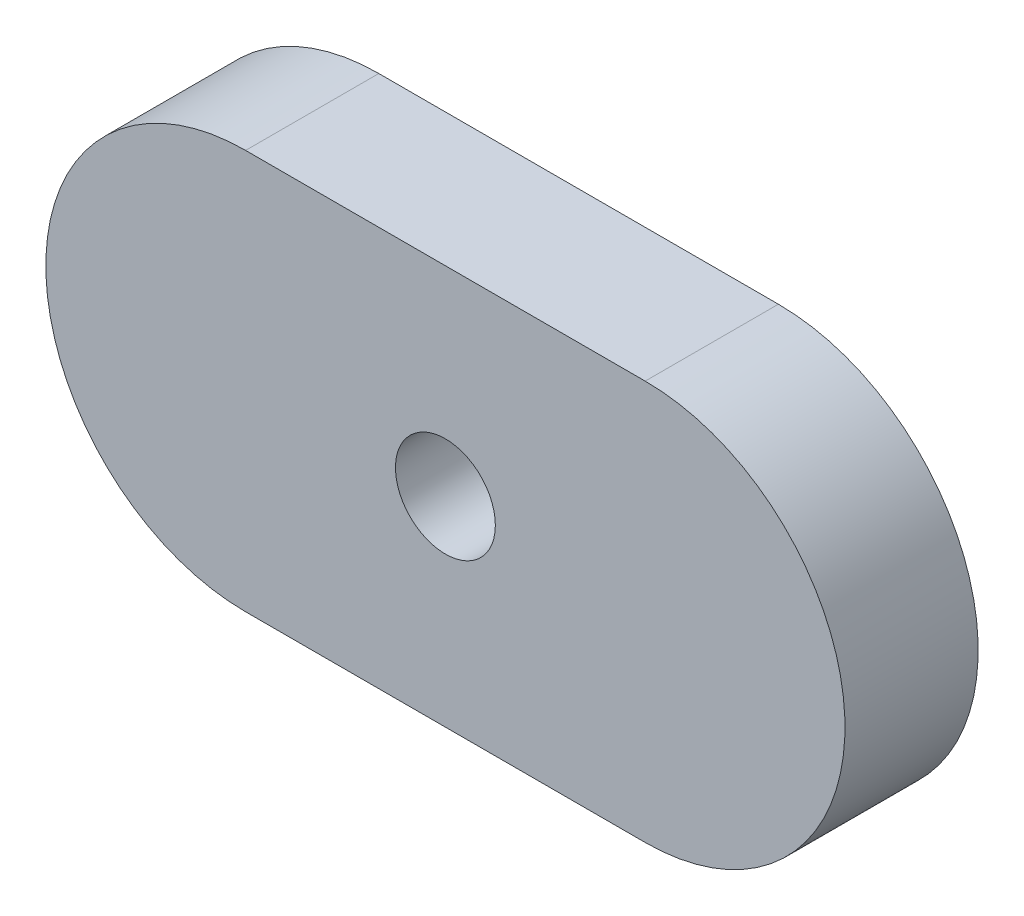
ISO-10303-21;
HEADER;
FILE_DESCRIPTION(('STEP AP214'),'2;1');
FILE_NAME('part.step','',(''),(''),'','','');
FILE_SCHEMA(('AUTOMOTIVE_DESIGN { 1 0 10303 214 1 1 1 1 }'));
ENDSEC;
DATA;
#1=APPLICATION_CONTEXT('core data for automotive mechanical design processes');
#2=APPLICATION_PROTOCOL_DEFINITION('international standard','automotive_design',2000,#1);
#3=PRODUCT_CONTEXT('',#1,'mechanical');
#4=PRODUCT('Part','Part','',(#3));
#5=PRODUCT_RELATED_PRODUCT_CATEGORY('part','',(#4));
#6=PRODUCT_DEFINITION_FORMATION('','',#4);
#7=PRODUCT_DEFINITION_CONTEXT('part definition',#1,'design');
#8=PRODUCT_DEFINITION('design','',#6,#7);
#9=PRODUCT_DEFINITION_SHAPE('','',#8);
#10=(LENGTH_UNIT() NAMED_UNIT(*) SI_UNIT(.MILLI.,.METRE.));
#11=(NAMED_UNIT(*) PLANE_ANGLE_UNIT() SI_UNIT($,.RADIAN.));
#12=(NAMED_UNIT(*) SI_UNIT($,.STERADIAN.) SOLID_ANGLE_UNIT());
#13=UNCERTAINTY_MEASURE_WITH_UNIT(LENGTH_MEASURE(1.E-05),#10,'distance_accuracy_value','');
#14=(GEOMETRIC_REPRESENTATION_CONTEXT(3) GLOBAL_UNCERTAINTY_ASSIGNED_CONTEXT((#13)) GLOBAL_UNIT_ASSIGNED_CONTEXT((#10,
#11,#12)) REPRESENTATION_CONTEXT('',''));
#15=CARTESIAN_POINT('',(0.,0.,0.));
#16=DIRECTION('',(0.,0.,1.));
#17=DIRECTION('',(1.,0.,0.));
#18=AXIS2_PLACEMENT_3D('',#15,#16,#17);
#19=CARTESIAN_POINT('',(0.,0.,0.508));
#20=DIRECTION('',(0.,0.,-1.));
#21=DIRECTION('',(-1.,0.,0.));
#22=AXIS2_PLACEMENT_3D('',#19,#20,#21);
#23=CYLINDRICAL_SURFACE('',#22,0.762);
#24=CARTESIAN_POINT('',(0.,0.,0.));
#25=DIRECTION('',(0.,0.,1.));
#26=DIRECTION('',(1.,0.,0.));
#27=AXIS2_PLACEMENT_3D('',#24,#25,#26);
#28=CIRCLE('',#27,0.762);
#29=CARTESIAN_POINT('',(0.,-0.762,0.));
#30=VERTEX_POINT('',#29);
#31=CARTESIAN_POINT('',(0.,0.762,0.));
#32=VERTEX_POINT('',#31);
#33=EDGE_CURVE('E98',#30,#32,#28,.T.);
#34=ORIENTED_EDGE('',*,*,#33,.T.);
#35=DIRECTION('',(0.,0.,-1.));
#36=VECTOR('',#35,1.);
#37=CARTESIAN_POINT('',(0.,0.762,0.508));
#38=LINE('',#37,#36);
#39=CARTESIAN_POINT('',(0.,0.762,0.508));
#40=VERTEX_POINT('',#39);
#41=EDGE_CURVE('E11',#40,#32,#38,.T.);
#42=ORIENTED_EDGE('',*,*,#41,.F.);
#43=CARTESIAN_POINT('',(0.,0.,0.508));
#44=DIRECTION('',(0.,0.,1.));
#45=DIRECTION('',(1.,0.,0.));
#46=AXIS2_PLACEMENT_3D('',#43,#44,#45);
#47=CIRCLE('',#46,0.762);
#48=CARTESIAN_POINT('',(0.,-0.762,0.508));
#49=VERTEX_POINT('',#48);
#50=EDGE_CURVE('E86',#49,#40,#47,.T.);
#51=ORIENTED_EDGE('',*,*,#50,.F.);
#52=DIRECTION('',(0.,0.,-1.));
#53=VECTOR('',#52,1.);
#54=CARTESIAN_POINT('',(0.,-0.762,0.508));
#55=LINE('',#54,#53);
#56=EDGE_CURVE('E94',#49,#30,#55,.T.);
#57=ORIENTED_EDGE('',*,*,#56,.T.);
#58=EDGE_LOOP('',(#34,#42,#51,#57));
#59=FACE_BOUND('',#58,.T.);
#60=ADVANCED_FACE('F35',(#59),#23,.T.);
#61=CARTESIAN_POINT('',(0.,0.762,0.508));
#62=DIRECTION('',(0.,-1.,0.));
#63=DIRECTION('',(1.,0.,0.));
#64=AXIS2_PLACEMENT_3D('',#61,#62,#63);
#65=PLANE('',#64);
#66=DIRECTION('',(-1.,0.,0.));
#67=VECTOR('',#66,1.);
#68=CARTESIAN_POINT('',(0.,0.762,0.));
#69=LINE('',#68,#67);
#70=CARTESIAN_POINT('',(-1.524,0.762,0.));
#71=VERTEX_POINT('',#70);
#72=EDGE_CURVE('E90',#32,#71,#69,.T.);
#73=ORIENTED_EDGE('',*,*,#72,.T.);
#74=DIRECTION('',(0.,0.,-1.));
#75=VECTOR('',#74,1.);
#76=CARTESIAN_POINT('',(-1.524,0.762,0.508));
#77=LINE('',#76,#75);
#78=CARTESIAN_POINT('',(-1.524,0.762,0.508));
#79=VERTEX_POINT('',#78);
#80=EDGE_CURVE('E43',#79,#71,#77,.T.);
#81=ORIENTED_EDGE('',*,*,#80,.F.);
#82=DIRECTION('',(-1.,0.,0.));
#83=VECTOR('',#82,1.);
#84=CARTESIAN_POINT('',(0.,0.762,0.508));
#85=LINE('',#84,#83);
#86=EDGE_CURVE('E81',#40,#79,#85,.T.);
#87=ORIENTED_EDGE('',*,*,#86,.F.);
#88=ORIENTED_EDGE('',*,*,#41,.T.);
#89=EDGE_LOOP('',(#73,#81,#87,#88));
#90=FACE_BOUND('',#89,.T.);
#91=ADVANCED_FACE('F89',(#90),#65,.F.);
#92=CARTESIAN_POINT('',(-1.524,0.,0.508));
#93=DIRECTION('',(0.,0.,-1.));
#94=DIRECTION('',(-1.,0.,0.));
#95=AXIS2_PLACEMENT_3D('',#92,#93,#94);
#96=CYLINDRICAL_SURFACE('',#95,0.762);
#97=CARTESIAN_POINT('',(-1.524,0.,0.));
#98=DIRECTION('',(0.,0.,1.));
#99=DIRECTION('',(1.,0.,0.));
#100=AXIS2_PLACEMENT_3D('',#97,#98,#99);
#101=CIRCLE('',#100,0.762);
#102=CARTESIAN_POINT('',(-1.524,-0.762,0.));
#103=VERTEX_POINT('',#102);
#104=EDGE_CURVE('E68',#71,#103,#101,.T.);
#105=ORIENTED_EDGE('',*,*,#104,.T.);
#106=DIRECTION('',(0.,0.,-1.));
#107=VECTOR('',#106,1.);
#108=CARTESIAN_POINT('',(-1.524,-0.762,0.508));
#109=LINE('',#108,#107);
#110=CARTESIAN_POINT('',(-1.524,-0.762,0.508));
#111=VERTEX_POINT('',#110);
#112=EDGE_CURVE('E91',#111,#103,#109,.T.);
#113=ORIENTED_EDGE('',*,*,#112,.F.);
#114=CARTESIAN_POINT('',(-1.524,0.,0.508));
#115=DIRECTION('',(0.,0.,1.));
#116=DIRECTION('',(1.,0.,0.));
#117=AXIS2_PLACEMENT_3D('',#114,#115,#116);
#118=CIRCLE('',#117,0.762);
#119=EDGE_CURVE('E84',#79,#111,#118,.T.);
#120=ORIENTED_EDGE('',*,*,#119,.F.);
#121=ORIENTED_EDGE('',*,*,#80,.T.);
#122=EDGE_LOOP('',(#105,#113,#120,#121));
#123=FACE_BOUND('',#122,.T.);
#124=ADVANCED_FACE('F92',(#123),#96,.T.);
#125=CARTESIAN_POINT('',(0.,-0.762,0.508));
#126=DIRECTION('',(0.,1.,0.));
#127=DIRECTION('',(-1.,0.,0.));
#128=AXIS2_PLACEMENT_3D('',#125,#126,#127);
#129=PLANE('',#128);
#130=DIRECTION('',(1.,0.,0.));
#131=VECTOR('',#130,1.);
#132=CARTESIAN_POINT('',(0.,-0.762,0.));
#133=LINE('',#132,#131);
#134=EDGE_CURVE('E74',#103,#30,#133,.T.);
#135=ORIENTED_EDGE('',*,*,#134,.T.);
#136=ORIENTED_EDGE('',*,*,#56,.F.);
#137=DIRECTION('',(1.,0.,0.));
#138=VECTOR('',#137,1.);
#139=CARTESIAN_POINT('',(0.,-0.762,0.508));
#140=LINE('',#139,#138);
#141=EDGE_CURVE('E51',#111,#49,#140,.T.);
#142=ORIENTED_EDGE('',*,*,#141,.F.);
#143=ORIENTED_EDGE('',*,*,#112,.T.);
#144=EDGE_LOOP('',(#135,#136,#142,#143));
#145=FACE_BOUND('',#144,.T.);
#146=ADVANCED_FACE('F106',(#145),#129,.F.);
#147=CARTESIAN_POINT('',(0.,0.,0.508));
#148=DIRECTION('',(0.,0.,1.));
#149=DIRECTION('',(1.,0.,0.));
#150=AXIS2_PLACEMENT_3D('',#147,#148,#149);
#151=PLANE('',#150);
#152=CARTESIAN_POINT('',(-0.762,0.,0.508));
#153=DIRECTION('',(0.,0.,1.));
#154=DIRECTION('',(1.,0.,0.));
#155=AXIS2_PLACEMENT_3D('',#152,#153,#154);
#156=CIRCLE('',#155,0.1905);
#157=CARTESIAN_POINT('',(-0.5715,0.,0.508));
#158=VERTEX_POINT('',#157);
#159=EDGE_CURVE('E112',#158,#158,#156,.T.);
#160=ORIENTED_EDGE('',*,*,#159,.F.);
#161=EDGE_LOOP('',(#160));
#162=FACE_BOUND('',#161,.T.);
#163=ORIENTED_EDGE('',*,*,#50,.T.);
#164=ORIENTED_EDGE('',*,*,#86,.T.);
#165=ORIENTED_EDGE('',*,*,#119,.T.);
#166=ORIENTED_EDGE('',*,*,#141,.T.);
#167=EDGE_LOOP('',(#163,#164,#165,#166));
#168=FACE_BOUND('',#167,.T.);
#169=ADVANCED_FACE('F82',(#162,#168),#151,.T.);
#170=CARTESIAN_POINT('',(0.,0.,0.));
#171=DIRECTION('',(0.,0.,1.));
#172=DIRECTION('',(1.,0.,0.));
#173=AXIS2_PLACEMENT_3D('',#170,#171,#172);
#174=PLANE('',#173);
#175=CARTESIAN_POINT('',(-0.762,0.,0.));
#176=DIRECTION('',(0.,0.,1.));
#177=DIRECTION('',(1.,0.,0.));
#178=AXIS2_PLACEMENT_3D('',#175,#176,#177);
#179=CIRCLE('',#178,0.1905);
#180=CARTESIAN_POINT('',(-0.5715,0.,0.));
#181=VERTEX_POINT('',#180);
#182=EDGE_CURVE('E101',#181,#181,#179,.T.);
#183=ORIENTED_EDGE('',*,*,#182,.T.);
#184=EDGE_LOOP('',(#183));
#185=FACE_BOUND('',#184,.T.);
#186=ORIENTED_EDGE('',*,*,#33,.F.);
#187=ORIENTED_EDGE('',*,*,#134,.F.);
#188=ORIENTED_EDGE('',*,*,#104,.F.);
#189=ORIENTED_EDGE('',*,*,#72,.F.);
#190=EDGE_LOOP('',(#186,#187,#188,#189));
#191=FACE_BOUND('',#190,.T.);
#192=ADVANCED_FACE('F109',(#185,#191),#174,.F.);
#193=CARTESIAN_POINT('',(-0.762,0.,0.));
#194=DIRECTION('',(0.,0.,1.));
#195=DIRECTION('',(1.,0.,0.));
#196=AXIS2_PLACEMENT_3D('',#193,#194,#195);
#197=CYLINDRICAL_SURFACE('',#196,0.1905);
#198=ORIENTED_EDGE('',*,*,#182,.F.);
#199=EDGE_LOOP('',(#198));
#200=FACE_BOUND('',#199,.T.);
#201=ORIENTED_EDGE('',*,*,#159,.T.);
#202=EDGE_LOOP('',(#201));
#203=FACE_BOUND('',#202,.T.);
#204=ADVANCED_FACE('F119',(#200,#203),#197,.F.);
#205=CLOSED_SHELL('',(#60,#91,#124,#146,#169,#192,#204));
#206=MANIFOLD_SOLID_BREP('B2',#205);
#207=ADVANCED_BREP_SHAPE_REPRESENTATION('',(#18,#206),#14);
#208=SHAPE_DEFINITION_REPRESENTATION(#9,#207);
ENDSEC;
END-ISO-10303-21;
